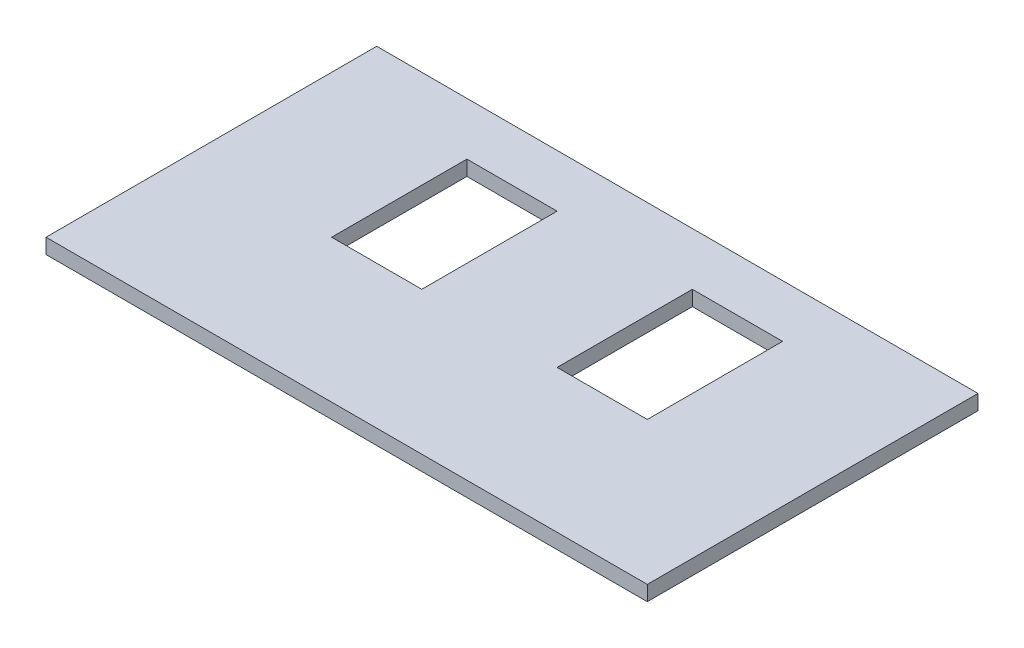
ISO-10303-21;
HEADER;
FILE_DESCRIPTION(('STEP AP214'),'2;1');
FILE_NAME('part.step','',(''),(''),'','','');
FILE_SCHEMA(('AUTOMOTIVE_DESIGN { 1 0 10303 214 1 1 1 1 }'));
ENDSEC;
DATA;
#1=APPLICATION_CONTEXT('core data for automotive mechanical design processes');
#2=APPLICATION_PROTOCOL_DEFINITION('international standard','automotive_design',2000,#1);
#3=PRODUCT_CONTEXT('',#1,'mechanical');
#4=PRODUCT('Part','Part','',(#3));
#5=PRODUCT_RELATED_PRODUCT_CATEGORY('part','',(#4));
#6=PRODUCT_DEFINITION_FORMATION('','',#4);
#7=PRODUCT_DEFINITION_CONTEXT('part definition',#1,'design');
#8=PRODUCT_DEFINITION('design','',#6,#7);
#9=PRODUCT_DEFINITION_SHAPE('','',#8);
#10=(LENGTH_UNIT() NAMED_UNIT(*) SI_UNIT(.MILLI.,.METRE.));
#11=(NAMED_UNIT(*) PLANE_ANGLE_UNIT() SI_UNIT($,.RADIAN.));
#12=(NAMED_UNIT(*) SI_UNIT($,.STERADIAN.) SOLID_ANGLE_UNIT());
#13=UNCERTAINTY_MEASURE_WITH_UNIT(LENGTH_MEASURE(1.E-05),#10,'distance_accuracy_value','');
#14=(GEOMETRIC_REPRESENTATION_CONTEXT(3) GLOBAL_UNCERTAINTY_ASSIGNED_CONTEXT((#13)) GLOBAL_UNIT_ASSIGNED_CONTEXT((#10,
#11,#12)) REPRESENTATION_CONTEXT('',''));
#15=CARTESIAN_POINT('',(0.,0.,0.));
#16=DIRECTION('',(0.,0.,1.));
#17=DIRECTION('',(1.,0.,0.));
#18=AXIS2_PLACEMENT_3D('',#15,#16,#17);
#19=CARTESIAN_POINT('',(0.,5.,0.));
#20=DIRECTION('',(0.,-1.,0.));
#21=DIRECTION('',(0.,0.,-1.));
#22=AXIS2_PLACEMENT_3D('',#19,#20,#21);
#23=PLANE('',#22);
#24=DIRECTION('',(0.,0.,1.));
#25=VECTOR('',#24,1.);
#26=CARTESIAN_POINT('',(47.5,5.,-92.5));
#27=LINE('',#26,#25);
#28=CARTESIAN_POINT('',(47.5,5.,-92.5));
#29=VERTEX_POINT('',#28);
#30=CARTESIAN_POINT('',(47.5,5.,-47.5));
#31=VERTEX_POINT('',#30);
#32=EDGE_CURVE('E160',#29,#31,#27,.T.);
#33=ORIENTED_EDGE('',*,*,#32,.F.);
#34=DIRECTION('',(-1.,0.,0.));
#35=VECTOR('',#34,1.);
#36=CARTESIAN_POINT('',(47.5,5.,-92.5));
#37=LINE('',#36,#35);
#38=CARTESIAN_POINT('',(77.5,5.,-92.5));
#39=VERTEX_POINT('',#38);
#40=EDGE_CURVE('E168',#39,#29,#37,.T.);
#41=ORIENTED_EDGE('',*,*,#40,.F.);
#42=DIRECTION('',(0.,0.,-1.));
#43=VECTOR('',#42,1.);
#44=CARTESIAN_POINT('',(77.5,5.,-92.5));
#45=LINE('',#44,#43);
#46=CARTESIAN_POINT('',(77.5,5.,-47.5));
#47=VERTEX_POINT('',#46);
#48=EDGE_CURVE('E165',#47,#39,#45,.T.);
#49=ORIENTED_EDGE('',*,*,#48,.F.);
#50=DIRECTION('',(1.,0.,0.));
#51=VECTOR('',#50,1.);
#52=CARTESIAN_POINT('',(47.5,5.,-47.5));
#53=LINE('',#52,#51);
#54=EDGE_CURVE('E162',#31,#47,#53,.T.);
#55=ORIENTED_EDGE('',*,*,#54,.F.);
#56=EDGE_LOOP('',(#33,#41,#49,#55));
#57=FACE_BOUND('',#56,.T.);
#58=DIRECTION('',(0.,0.,1.));
#59=VECTOR('',#58,1.);
#60=CARTESIAN_POINT('',(0.,5.,0.));
#61=LINE('',#60,#59);
#62=CARTESIAN_POINT('',(0.,5.,-110.));
#63=VERTEX_POINT('',#62);
#64=CARTESIAN_POINT('',(0.,5.,0.));
#65=VERTEX_POINT('',#64);
#66=EDGE_CURVE('E191',#63,#65,#61,.T.);
#67=ORIENTED_EDGE('',*,*,#66,.T.);
#68=DIRECTION('',(1.,0.,0.));
#69=VECTOR('',#68,1.);
#70=CARTESIAN_POINT('',(0.,5.,0.));
#71=LINE('',#70,#69);
#72=CARTESIAN_POINT('',(200.,5.,0.));
#73=VERTEX_POINT('',#72);
#74=EDGE_CURVE('E194',#65,#73,#71,.T.);
#75=ORIENTED_EDGE('',*,*,#74,.T.);
#76=DIRECTION('',(0.,0.,-1.));
#77=VECTOR('',#76,1.);
#78=CARTESIAN_POINT('',(200.,5.,0.));
#79=LINE('',#78,#77);
#80=CARTESIAN_POINT('',(200.,5.,-110.));
#81=VERTEX_POINT('',#80);
#82=EDGE_CURVE('E197',#73,#81,#79,.T.);
#83=ORIENTED_EDGE('',*,*,#82,.T.);
#84=DIRECTION('',(-1.,0.,0.));
#85=VECTOR('',#84,1.);
#86=CARTESIAN_POINT('',(0.,5.,-110.));
#87=LINE('',#86,#85);
#88=EDGE_CURVE('E199',#81,#63,#87,.T.);
#89=ORIENTED_EDGE('',*,*,#88,.T.);
#90=EDGE_LOOP('',(#67,#75,#83,#89));
#91=FACE_BOUND('',#90,.T.);
#92=DIRECTION('',(-1.,0.,0.));
#93=VECTOR('',#92,1.);
#94=CARTESIAN_POINT('',(152.5,5.,-92.5));
#95=LINE('',#94,#93);
#96=CARTESIAN_POINT('',(152.5,5.,-92.5));
#97=VERTEX_POINT('',#96);
#98=CARTESIAN_POINT('',(122.5,5.,-92.5));
#99=VERTEX_POINT('',#98);
#100=EDGE_CURVE('E124',#97,#99,#95,.T.);
#101=ORIENTED_EDGE('',*,*,#100,.F.);
#102=DIRECTION('',(0.,0.,-1.));
#103=VECTOR('',#102,1.);
#104=CARTESIAN_POINT('',(152.5,5.,-92.5));
#105=LINE('',#104,#103);
#106=CARTESIAN_POINT('',(152.5,5.,-47.5));
#107=VERTEX_POINT('',#106);
#108=EDGE_CURVE('E146',#107,#97,#105,.T.);
#109=ORIENTED_EDGE('',*,*,#108,.F.);
#110=DIRECTION('',(1.,0.,0.));
#111=VECTOR('',#110,1.);
#112=CARTESIAN_POINT('',(152.5,5.,-47.5));
#113=LINE('',#112,#111);
#114=CARTESIAN_POINT('',(122.5,5.,-47.5));
#115=VERTEX_POINT('',#114);
#116=EDGE_CURVE('E144',#115,#107,#113,.T.);
#117=ORIENTED_EDGE('',*,*,#116,.F.);
#118=DIRECTION('',(0.,0.,1.));
#119=VECTOR('',#118,1.);
#120=CARTESIAN_POINT('',(122.5,5.,-92.5));
#121=LINE('',#120,#119);
#122=EDGE_CURVE('E132',#99,#115,#121,.T.);
#123=ORIENTED_EDGE('',*,*,#122,.F.);
#124=EDGE_LOOP('',(#101,#109,#117,#123));
#125=FACE_BOUND('',#124,.T.);
#126=ADVANCED_FACE('F35',(#57,#91,#125),#23,.F.);
#127=CARTESIAN_POINT('',(0.,0.,0.));
#128=DIRECTION('',(0.,-1.,0.));
#129=DIRECTION('',(0.,0.,-1.));
#130=AXIS2_PLACEMENT_3D('',#127,#128,#129);
#131=PLANE('',#130);
#132=DIRECTION('',(0.,0.,1.));
#133=VECTOR('',#132,1.);
#134=CARTESIAN_POINT('',(0.,0.,0.));
#135=LINE('',#134,#133);
#136=CARTESIAN_POINT('',(0.,0.,-110.));
#137=VERTEX_POINT('',#136);
#138=CARTESIAN_POINT('',(0.,0.,0.));
#139=VERTEX_POINT('',#138);
#140=EDGE_CURVE('E190',#137,#139,#135,.T.);
#141=ORIENTED_EDGE('',*,*,#140,.F.);
#142=DIRECTION('',(-1.,0.,0.));
#143=VECTOR('',#142,1.);
#144=CARTESIAN_POINT('',(0.,0.,-110.));
#145=LINE('',#144,#143);
#146=CARTESIAN_POINT('',(200.,0.,-110.));
#147=VERTEX_POINT('',#146);
#148=EDGE_CURVE('E195',#147,#137,#145,.T.);
#149=ORIENTED_EDGE('',*,*,#148,.F.);
#150=DIRECTION('',(0.,0.,-1.));
#151=VECTOR('',#150,1.);
#152=CARTESIAN_POINT('',(200.,0.,0.));
#153=LINE('',#152,#151);
#154=CARTESIAN_POINT('',(200.,0.,0.));
#155=VERTEX_POINT('',#154);
#156=EDGE_CURVE('E206',#155,#147,#153,.T.);
#157=ORIENTED_EDGE('',*,*,#156,.F.);
#158=DIRECTION('',(1.,0.,0.));
#159=VECTOR('',#158,1.);
#160=CARTESIAN_POINT('',(0.,0.,0.));
#161=LINE('',#160,#159);
#162=EDGE_CURVE('E204',#139,#155,#161,.T.);
#163=ORIENTED_EDGE('',*,*,#162,.F.);
#164=EDGE_LOOP('',(#141,#149,#157,#163));
#165=FACE_BOUND('',#164,.T.);
#166=DIRECTION('',(-1.,0.,0.));
#167=VECTOR('',#166,1.);
#168=CARTESIAN_POINT('',(47.5,0.,-92.5));
#169=LINE('',#168,#167);
#170=CARTESIAN_POINT('',(77.5,0.,-92.5));
#171=VERTEX_POINT('',#170);
#172=CARTESIAN_POINT('',(47.5,0.,-92.5));
#173=VERTEX_POINT('',#172);
#174=EDGE_CURVE('E163',#171,#173,#169,.T.);
#175=ORIENTED_EDGE('',*,*,#174,.T.);
#176=DIRECTION('',(0.,0.,1.));
#177=VECTOR('',#176,1.);
#178=CARTESIAN_POINT('',(47.5,0.,-92.5));
#179=LINE('',#178,#177);
#180=CARTESIAN_POINT('',(47.5,0.,-47.5));
#181=VERTEX_POINT('',#180);
#182=EDGE_CURVE('E140',#173,#181,#179,.T.);
#183=ORIENTED_EDGE('',*,*,#182,.T.);
#184=DIRECTION('',(1.,0.,0.));
#185=VECTOR('',#184,1.);
#186=CARTESIAN_POINT('',(47.5,0.,-47.5));
#187=LINE('',#186,#185);
#188=CARTESIAN_POINT('',(77.5,0.,-47.5));
#189=VERTEX_POINT('',#188);
#190=EDGE_CURVE('E173',#181,#189,#187,.T.);
#191=ORIENTED_EDGE('',*,*,#190,.T.);
#192=DIRECTION('',(0.,0.,-1.));
#193=VECTOR('',#192,1.);
#194=CARTESIAN_POINT('',(77.5,0.,-92.5));
#195=LINE('',#194,#193);
#196=EDGE_CURVE('E176',#189,#171,#195,.T.);
#197=ORIENTED_EDGE('',*,*,#196,.T.);
#198=EDGE_LOOP('',(#175,#183,#191,#197));
#199=FACE_BOUND('',#198,.T.);
#200=DIRECTION('',(0.,0.,-1.));
#201=VECTOR('',#200,1.);
#202=CARTESIAN_POINT('',(152.5,0.,-92.5));
#203=LINE('',#202,#201);
#204=CARTESIAN_POINT('',(152.5,0.,-47.5));
#205=VERTEX_POINT('',#204);
#206=CARTESIAN_POINT('',(152.5,0.,-92.5));
#207=VERTEX_POINT('',#206);
#208=EDGE_CURVE('E133',#205,#207,#203,.T.);
#209=ORIENTED_EDGE('',*,*,#208,.T.);
#210=DIRECTION('',(-1.,0.,0.));
#211=VECTOR('',#210,1.);
#212=CARTESIAN_POINT('',(152.5,0.,-92.5));
#213=LINE('',#212,#211);
#214=CARTESIAN_POINT('',(122.5,0.,-92.5));
#215=VERTEX_POINT('',#214);
#216=EDGE_CURVE('E58',#207,#215,#213,.T.);
#217=ORIENTED_EDGE('',*,*,#216,.T.);
#218=DIRECTION('',(0.,0.,1.));
#219=VECTOR('',#218,1.);
#220=CARTESIAN_POINT('',(122.5,0.,-92.5));
#221=LINE('',#220,#219);
#222=CARTESIAN_POINT('',(122.5,0.,-47.5));
#223=VERTEX_POINT('',#222);
#224=EDGE_CURVE('E139',#215,#223,#221,.T.);
#225=ORIENTED_EDGE('',*,*,#224,.T.);
#226=DIRECTION('',(1.,0.,0.));
#227=VECTOR('',#226,1.);
#228=CARTESIAN_POINT('',(152.5,0.,-47.5));
#229=LINE('',#228,#227);
#230=EDGE_CURVE('E152',#223,#205,#229,.T.);
#231=ORIENTED_EDGE('',*,*,#230,.T.);
#232=EDGE_LOOP('',(#209,#217,#225,#231));
#233=FACE_BOUND('',#232,.T.);
#234=ADVANCED_FACE('F224',(#165,#199,#233),#131,.T.);
#235=CARTESIAN_POINT('',(0.,5.,0.));
#236=DIRECTION('',(1.,0.,0.));
#237=DIRECTION('',(0.,0.,-1.));
#238=AXIS2_PLACEMENT_3D('',#235,#236,#237);
#239=PLANE('',#238);
#240=ORIENTED_EDGE('',*,*,#140,.T.);
#241=DIRECTION('',(0.,-1.,0.));
#242=VECTOR('',#241,1.);
#243=CARTESIAN_POINT('',(0.,5.,0.));
#244=LINE('',#243,#242);
#245=EDGE_CURVE('E11',#65,#139,#244,.T.);
#246=ORIENTED_EDGE('',*,*,#245,.F.);
#247=ORIENTED_EDGE('',*,*,#66,.F.);
#248=DIRECTION('',(0.,-1.,0.));
#249=VECTOR('',#248,1.);
#250=CARTESIAN_POINT('',(0.,5.,-110.));
#251=LINE('',#250,#249);
#252=EDGE_CURVE('E201',#63,#137,#251,.T.);
#253=ORIENTED_EDGE('',*,*,#252,.T.);
#254=EDGE_LOOP('',(#240,#246,#247,#253));
#255=FACE_BOUND('',#254,.T.);
#256=ADVANCED_FACE('F37',(#255),#239,.F.);
#257=CARTESIAN_POINT('',(0.,5.,0.));
#258=DIRECTION('',(0.,0.,-1.));
#259=DIRECTION('',(-1.,0.,0.));
#260=AXIS2_PLACEMENT_3D('',#257,#258,#259);
#261=PLANE('',#260);
#262=ORIENTED_EDGE('',*,*,#162,.T.);
#263=DIRECTION('',(0.,-1.,0.));
#264=VECTOR('',#263,1.);
#265=CARTESIAN_POINT('',(200.,5.,0.));
#266=LINE('',#265,#264);
#267=EDGE_CURVE('E43',#73,#155,#266,.T.);
#268=ORIENTED_EDGE('',*,*,#267,.F.);
#269=ORIENTED_EDGE('',*,*,#74,.F.);
#270=ORIENTED_EDGE('',*,*,#245,.T.);
#271=EDGE_LOOP('',(#262,#268,#269,#270));
#272=FACE_BOUND('',#271,.T.);
#273=ADVANCED_FACE('F234',(#272),#261,.F.);
#274=CARTESIAN_POINT('',(200.,5.,0.));
#275=DIRECTION('',(-1.,0.,0.));
#276=DIRECTION('',(0.,0.,1.));
#277=AXIS2_PLACEMENT_3D('',#274,#275,#276);
#278=PLANE('',#277);
#279=ORIENTED_EDGE('',*,*,#156,.T.);
#280=DIRECTION('',(0.,-1.,0.));
#281=VECTOR('',#280,1.);
#282=CARTESIAN_POINT('',(200.,5.,-110.));
#283=LINE('',#282,#281);
#284=EDGE_CURVE('E211',#81,#147,#283,.T.);
#285=ORIENTED_EDGE('',*,*,#284,.F.);
#286=ORIENTED_EDGE('',*,*,#82,.F.);
#287=ORIENTED_EDGE('',*,*,#267,.T.);
#288=EDGE_LOOP('',(#279,#285,#286,#287));
#289=FACE_BOUND('',#288,.T.);
#290=ADVANCED_FACE('F218',(#289),#278,.F.);
#291=CARTESIAN_POINT('',(0.,5.,-110.));
#292=DIRECTION('',(0.,0.,1.));
#293=DIRECTION('',(1.,0.,0.));
#294=AXIS2_PLACEMENT_3D('',#291,#292,#293);
#295=PLANE('',#294);
#296=ORIENTED_EDGE('',*,*,#148,.T.);
#297=ORIENTED_EDGE('',*,*,#252,.F.);
#298=ORIENTED_EDGE('',*,*,#88,.F.);
#299=ORIENTED_EDGE('',*,*,#284,.T.);
#300=EDGE_LOOP('',(#296,#297,#298,#299));
#301=FACE_BOUND('',#300,.T.);
#302=ADVANCED_FACE('F228',(#301),#295,.F.);
#303=CARTESIAN_POINT('',(47.5,5.,-92.5));
#304=DIRECTION('',(1.,0.,0.));
#305=DIRECTION('',(0.,0.,-1.));
#306=AXIS2_PLACEMENT_3D('',#303,#304,#305);
#307=PLANE('',#306);
#308=ORIENTED_EDGE('',*,*,#182,.F.);
#309=DIRECTION('',(0.,-1.,0.));
#310=VECTOR('',#309,1.);
#311=CARTESIAN_POINT('',(47.5,5.,-92.5));
#312=LINE('',#311,#310);
#313=EDGE_CURVE('E170',#29,#173,#312,.T.);
#314=ORIENTED_EDGE('',*,*,#313,.F.);
#315=ORIENTED_EDGE('',*,*,#32,.T.);
#316=DIRECTION('',(0.,-1.,0.));
#317=VECTOR('',#316,1.);
#318=CARTESIAN_POINT('',(47.5,5.,-47.5));
#319=LINE('',#318,#317);
#320=EDGE_CURVE('E187',#31,#181,#319,.T.);
#321=ORIENTED_EDGE('',*,*,#320,.T.);
#322=EDGE_LOOP('',(#308,#314,#315,#321));
#323=FACE_BOUND('',#322,.T.);
#324=ADVANCED_FACE('F250',(#323),#307,.T.);
#325=CARTESIAN_POINT('',(47.5,5.,-47.5));
#326=DIRECTION('',(0.,0.,-1.));
#327=DIRECTION('',(-1.,0.,0.));
#328=AXIS2_PLACEMENT_3D('',#325,#326,#327);
#329=PLANE('',#328);
#330=ORIENTED_EDGE('',*,*,#190,.F.);
#331=ORIENTED_EDGE('',*,*,#320,.F.);
#332=ORIENTED_EDGE('',*,*,#54,.T.);
#333=DIRECTION('',(0.,-1.,0.));
#334=VECTOR('',#333,1.);
#335=CARTESIAN_POINT('',(77.5,5.,-47.5));
#336=LINE('',#335,#334);
#337=EDGE_CURVE('E185',#47,#189,#336,.T.);
#338=ORIENTED_EDGE('',*,*,#337,.T.);
#339=EDGE_LOOP('',(#330,#331,#332,#338));
#340=FACE_BOUND('',#339,.T.);
#341=ADVANCED_FACE('F257',(#340),#329,.T.);
#342=CARTESIAN_POINT('',(77.5,5.,-92.5));
#343=DIRECTION('',(-1.,0.,0.));
#344=DIRECTION('',(0.,0.,1.));
#345=AXIS2_PLACEMENT_3D('',#342,#343,#344);
#346=PLANE('',#345);
#347=ORIENTED_EDGE('',*,*,#196,.F.);
#348=ORIENTED_EDGE('',*,*,#337,.F.);
#349=ORIENTED_EDGE('',*,*,#48,.T.);
#350=DIRECTION('',(0.,-1.,0.));
#351=VECTOR('',#350,1.);
#352=CARTESIAN_POINT('',(77.5,5.,-92.5));
#353=LINE('',#352,#351);
#354=EDGE_CURVE('E183',#39,#171,#353,.T.);
#355=ORIENTED_EDGE('',*,*,#354,.T.);
#356=EDGE_LOOP('',(#347,#348,#349,#355));
#357=FACE_BOUND('',#356,.T.);
#358=ADVANCED_FACE('F262',(#357),#346,.T.);
#359=CARTESIAN_POINT('',(47.5,5.,-92.5));
#360=DIRECTION('',(0.,0.,1.));
#361=DIRECTION('',(1.,0.,0.));
#362=AXIS2_PLACEMENT_3D('',#359,#360,#361);
#363=PLANE('',#362);
#364=ORIENTED_EDGE('',*,*,#174,.F.);
#365=ORIENTED_EDGE('',*,*,#354,.F.);
#366=ORIENTED_EDGE('',*,*,#40,.T.);
#367=ORIENTED_EDGE('',*,*,#313,.T.);
#368=EDGE_LOOP('',(#364,#365,#366,#367));
#369=FACE_BOUND('',#368,.T.);
#370=ADVANCED_FACE('F268',(#369),#363,.T.);
#371=CARTESIAN_POINT('',(152.5,5.,-92.5));
#372=DIRECTION('',(0.,0.,1.));
#373=DIRECTION('',(1.,0.,0.));
#374=AXIS2_PLACEMENT_3D('',#371,#372,#373);
#375=PLANE('',#374);
#376=ORIENTED_EDGE('',*,*,#216,.F.);
#377=DIRECTION('',(0.,-1.,0.));
#378=VECTOR('',#377,1.);
#379=CARTESIAN_POINT('',(152.5,5.,-92.5));
#380=LINE('',#379,#378);
#381=EDGE_CURVE('E128',#97,#207,#380,.T.);
#382=ORIENTED_EDGE('',*,*,#381,.F.);
#383=ORIENTED_EDGE('',*,*,#100,.T.);
#384=DIRECTION('',(0.,-1.,0.));
#385=VECTOR('',#384,1.);
#386=CARTESIAN_POINT('',(122.5,5.,-92.5));
#387=LINE('',#386,#385);
#388=EDGE_CURVE('E127',#99,#215,#387,.T.);
#389=ORIENTED_EDGE('',*,*,#388,.T.);
#390=EDGE_LOOP('',(#376,#382,#383,#389));
#391=FACE_BOUND('',#390,.T.);
#392=ADVANCED_FACE('F126',(#391),#375,.T.);
#393=CARTESIAN_POINT('',(122.5,5.,-92.5));
#394=DIRECTION('',(1.,0.,0.));
#395=DIRECTION('',(0.,0.,-1.));
#396=AXIS2_PLACEMENT_3D('',#393,#394,#395);
#397=PLANE('',#396);
#398=ORIENTED_EDGE('',*,*,#224,.F.);
#399=ORIENTED_EDGE('',*,*,#388,.F.);
#400=ORIENTED_EDGE('',*,*,#122,.T.);
#401=DIRECTION('',(0.,-1.,0.));
#402=VECTOR('',#401,1.);
#403=CARTESIAN_POINT('',(122.5,5.,-47.5));
#404=LINE('',#403,#402);
#405=EDGE_CURVE('E141',#115,#223,#404,.T.);
#406=ORIENTED_EDGE('',*,*,#405,.T.);
#407=EDGE_LOOP('',(#398,#399,#400,#406));
#408=FACE_BOUND('',#407,.T.);
#409=ADVANCED_FACE('F136',(#408),#397,.T.);
#410=CARTESIAN_POINT('',(152.5,5.,-47.5));
#411=DIRECTION('',(0.,0.,-1.));
#412=DIRECTION('',(-1.,0.,0.));
#413=AXIS2_PLACEMENT_3D('',#410,#411,#412);
#414=PLANE('',#413);
#415=ORIENTED_EDGE('',*,*,#230,.F.);
#416=ORIENTED_EDGE('',*,*,#405,.F.);
#417=ORIENTED_EDGE('',*,*,#116,.T.);
#418=DIRECTION('',(0.,-1.,0.));
#419=VECTOR('',#418,1.);
#420=CARTESIAN_POINT('',(152.5,5.,-47.5));
#421=LINE('',#420,#419);
#422=EDGE_CURVE('E50',#107,#205,#421,.T.);
#423=ORIENTED_EDGE('',*,*,#422,.T.);
#424=EDGE_LOOP('',(#415,#416,#417,#423));
#425=FACE_BOUND('',#424,.T.);
#426=ADVANCED_FACE('F287',(#425),#414,.T.);
#427=CARTESIAN_POINT('',(152.5,5.,-92.5));
#428=DIRECTION('',(-1.,0.,0.));
#429=DIRECTION('',(0.,0.,1.));
#430=AXIS2_PLACEMENT_3D('',#427,#428,#429);
#431=PLANE('',#430);
#432=ORIENTED_EDGE('',*,*,#208,.F.);
#433=ORIENTED_EDGE('',*,*,#422,.F.);
#434=ORIENTED_EDGE('',*,*,#108,.T.);
#435=ORIENTED_EDGE('',*,*,#381,.T.);
#436=EDGE_LOOP('',(#432,#433,#434,#435));
#437=FACE_BOUND('',#436,.T.);
#438=ADVANCED_FACE('F290',(#437),#431,.T.);
#439=CLOSED_SHELL('',(#126,#234,#256,#273,#290,#302,#324,#341,#358,#370,#392,#409,#426,#438));
#440=MANIFOLD_SOLID_BREP('B2',#439);
#441=ADVANCED_BREP_SHAPE_REPRESENTATION('',(#18,#440),#14);
#442=SHAPE_DEFINITION_REPRESENTATION(#9,#441);
ENDSEC;
END-ISO-10303-21;
